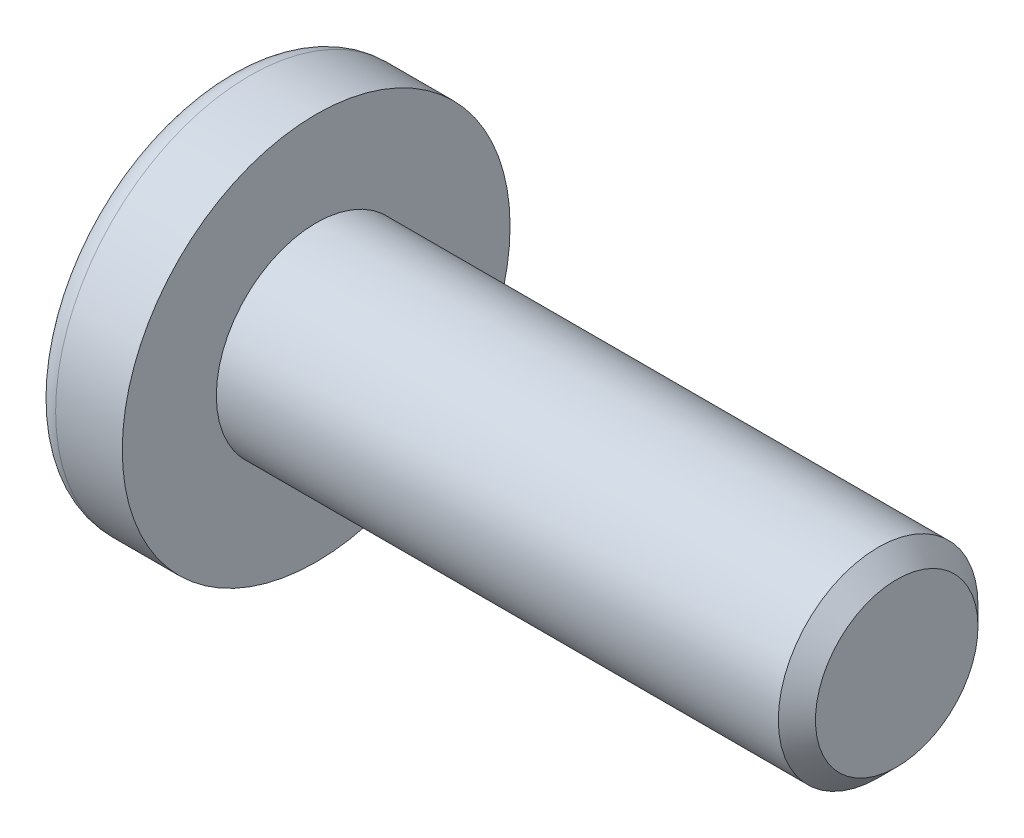
ISO-10303-21;
HEADER;
FILE_DESCRIPTION(('STEP AP214'),'2;1');
FILE_NAME('part.step','',(''),(''),'','','');
FILE_SCHEMA(('AUTOMOTIVE_DESIGN { 1 0 10303 214 1 1 1 1 }'));
ENDSEC;
DATA;
#1=APPLICATION_CONTEXT('core data for automotive mechanical design processes');
#2=APPLICATION_PROTOCOL_DEFINITION('international standard','automotive_design',2000,#1);
#3=PRODUCT_CONTEXT('',#1,'mechanical');
#4=PRODUCT('Part','Part','',(#3));
#5=PRODUCT_RELATED_PRODUCT_CATEGORY('part','',(#4));
#6=PRODUCT_DEFINITION_FORMATION('','',#4);
#7=PRODUCT_DEFINITION_CONTEXT('part definition',#1,'design');
#8=PRODUCT_DEFINITION('design','',#6,#7);
#9=PRODUCT_DEFINITION_SHAPE('','',#8);
#10=(LENGTH_UNIT() NAMED_UNIT(*) SI_UNIT(.MILLI.,.METRE.));
#11=(NAMED_UNIT(*) PLANE_ANGLE_UNIT() SI_UNIT($,.RADIAN.));
#12=(NAMED_UNIT(*) SI_UNIT($,.STERADIAN.) SOLID_ANGLE_UNIT());
#13=UNCERTAINTY_MEASURE_WITH_UNIT(LENGTH_MEASURE(1.E-05),#10,'distance_accuracy_value','');
#14=(GEOMETRIC_REPRESENTATION_CONTEXT(3) GLOBAL_UNCERTAINTY_ASSIGNED_CONTEXT((#13)) GLOBAL_UNIT_ASSIGNED_CONTEXT((#10,
#11,#12)) REPRESENTATION_CONTEXT('',''));
#15=CARTESIAN_POINT('',(0.,0.,0.));
#16=DIRECTION('',(0.,0.,1.));
#17=DIRECTION('',(1.,0.,0.));
#18=AXIS2_PLACEMENT_3D('',#15,#16,#17);
#19=CARTESIAN_POINT('',(3.49504,0.,0.));
#20=DIRECTION('',(-1.,0.,0.));
#21=DIRECTION('',(0.,1.,0.));
#22=AXIS2_PLACEMENT_3D('',#19,#20,#21);
#23=SPHERICAL_SURFACE('',#22,3.49504);
#24=CARTESIAN_POINT('',(0.638066947960321,0.,0.));
#25=DIRECTION('',(-1.,0.,0.));
#26=DIRECTION('',(0.,0.,1.));
#27=AXIS2_PLACEMENT_3D('',#24,#25,#26);
#28=CIRCLE('',#27,2.01320877742947);
#29=CARTESIAN_POINT('',(0.638066947960321,0.,2.01320877742947));
#30=VERTEX_POINT('',#29);
#31=EDGE_CURVE('E156',#30,#30,#28,.T.);
#32=ORIENTED_EDGE('',*,*,#31,.T.);
#33=EDGE_LOOP('',(#32));
#34=FACE_BOUND('',#33,.T.);
#35=CARTESIAN_POINT('',(3.48860800425343,-0.0562204072662827,0.));
#36=DIRECTION('',(-0.113665320353011,-0.99351909641891,0.));
#37=DIRECTION('',(0.99351909641891,-0.113665320353011,0.));
#38=AXIS2_PLACEMENT_3D('',#35,#36,#37);
#39=CIRCLE('',#38,3.49458187725478);
#40=CARTESIAN_POINT('',(0.227775025036725,0.316840992898337,1.19995665346604));
#41=VERTEX_POINT('',#40);
#42=CARTESIAN_POINT('',(0.033060362162214,0.339117670430593,0.339117670430594));
#43=VERTEX_POINT('',#42);
#44=EDGE_CURVE('E266',#41,#43,#39,.T.);
#45=ORIENTED_EDGE('',*,*,#44,.F.);
#46=CARTESIAN_POINT('',(2.78874832810788,0.,-0.872695468934766));
#47=DIRECTION('',(0.629103472698606,0.,0.777321568360582));
#48=DIRECTION('',(0.777321568360582,0.,-0.629103472698606));
#49=AXIS2_PLACEMENT_3D('',#46,#47,#48);
#50=CIRCLE('',#49,3.30981257691679);
#51=CARTESIAN_POINT('',(0.227775025036724,-0.316840992898345,1.19995665346604));
#52=VERTEX_POINT('',#51);
#53=EDGE_CURVE('E155',#41,#52,#50,.T.);
#54=ORIENTED_EDGE('',*,*,#53,.T.);
#55=CARTESIAN_POINT('',(3.48860800425343,0.0562204072662819,0.));
#56=DIRECTION('',(-0.113665320353011,0.99351909641891,0.));
#57=DIRECTION('',(-0.99351909641891,-0.113665320353011,0.));
#58=AXIS2_PLACEMENT_3D('',#55,#56,#57);
#59=CIRCLE('',#58,3.49458187725478);
#60=CARTESIAN_POINT('',(0.0330603621622127,-0.339117670430595,0.339117670430594));
#61=VERTEX_POINT('',#60);
#62=EDGE_CURVE('E111',#61,#52,#59,.T.);
#63=ORIENTED_EDGE('',*,*,#62,.F.);
#64=CARTESIAN_POINT('',(3.48860800425343,0.,-0.056220407266282));
#65=DIRECTION('',(-0.113665320353011,0.,-0.99351909641891));
#66=DIRECTION('',(-0.99351909641891,0.,0.113665320353011));
#67=AXIS2_PLACEMENT_3D('',#64,#65,#66);
#68=CIRCLE('',#67,3.49458187725478);
#69=CARTESIAN_POINT('',(0.227775025036724,-1.19995665346604,0.316840992898341));
#70=VERTEX_POINT('',#69);
#71=EDGE_CURVE('E136',#70,#61,#68,.T.);
#72=ORIENTED_EDGE('',*,*,#71,.F.);
#73=CARTESIAN_POINT('',(2.78874832810788,0.872695468934764,0.));
#74=DIRECTION('',(0.629103472698606,-0.777321568360582,0.));
#75=DIRECTION('',(0.777321568360582,0.629103472698606,0.));
#76=AXIS2_PLACEMENT_3D('',#73,#74,#75);
#77=CIRCLE('',#76,3.30981257691679);
#78=CARTESIAN_POINT('',(0.227775025036722,-1.19995665346604,-0.316840992898341));
#79=VERTEX_POINT('',#78);
#80=EDGE_CURVE('E144',#70,#79,#77,.T.);
#81=ORIENTED_EDGE('',*,*,#80,.T.);
#82=CARTESIAN_POINT('',(3.48860800425343,0.,0.0562204072662826));
#83=DIRECTION('',(-0.113665320353011,0.,0.99351909641891));
#84=DIRECTION('',(0.99351909641891,0.,0.113665320353011));
#85=AXIS2_PLACEMENT_3D('',#82,#83,#84);
#86=CIRCLE('',#85,3.49458187725478);
#87=CARTESIAN_POINT('',(0.0330603621622127,-0.339117670430592,-0.339117670430594));
#88=VERTEX_POINT('',#87);
#89=EDGE_CURVE('E52',#88,#79,#86,.T.);
#90=ORIENTED_EDGE('',*,*,#89,.F.);
#91=CARTESIAN_POINT('',(0.227775025036724,-0.316840992898336,-1.19995665346604));
#92=VERTEX_POINT('',#91);
#93=EDGE_CURVE('E261',#92,#88,#59,.T.);
#94=ORIENTED_EDGE('',*,*,#93,.F.);
#95=CARTESIAN_POINT('',(2.78874832810788,0.,0.872695468934766));
#96=DIRECTION('',(0.629103472698606,0.,-0.777321568360582));
#97=DIRECTION('',(-0.777321568360582,0.,-0.629103472698606));
#98=AXIS2_PLACEMENT_3D('',#95,#96,#97);
#99=CIRCLE('',#98,3.30981257691679);
#100=CARTESIAN_POINT('',(0.227775025036724,0.316840992898345,-1.19995665346604));
#101=VERTEX_POINT('',#100);
#102=EDGE_CURVE('E137',#92,#101,#99,.T.);
#103=ORIENTED_EDGE('',*,*,#102,.T.);
#104=CARTESIAN_POINT('',(0.033060362162214,0.339117670430595,-0.339117670430594));
#105=VERTEX_POINT('',#104);
#106=EDGE_CURVE('E271',#105,#101,#39,.T.);
#107=ORIENTED_EDGE('',*,*,#106,.F.);
#108=CARTESIAN_POINT('',(0.227775025036726,1.19995665346604,-0.316840992898341));
#109=VERTEX_POINT('',#108);
#110=EDGE_CURVE('E172',#109,#105,#86,.T.);
#111=ORIENTED_EDGE('',*,*,#110,.F.);
#112=CARTESIAN_POINT('',(2.78874832810788,-0.872695468934769,0.));
#113=DIRECTION('',(0.629103472698606,0.777321568360582,0.));
#114=DIRECTION('',(-0.777321568360582,0.629103472698606,0.));
#115=AXIS2_PLACEMENT_3D('',#112,#113,#114);
#116=CIRCLE('',#115,3.30981257691679);
#117=CARTESIAN_POINT('',(0.227775025036726,1.19995665346604,0.31684099289834));
#118=VERTEX_POINT('',#117);
#119=EDGE_CURVE('E60',#109,#118,#116,.T.);
#120=ORIENTED_EDGE('',*,*,#119,.T.);
#121=EDGE_CURVE('E170',#43,#118,#68,.T.);
#122=ORIENTED_EDGE('',*,*,#121,.F.);
#123=EDGE_LOOP('',(#45,#54,#63,#72,#81,#90,#94,#103,#107,#111,#120,#122));
#124=FACE_BOUND('',#123,.T.);
#125=ADVANCED_FACE('F37',(#34,#124),#23,.T.);
#126=CARTESIAN_POINT('',(1.71044397905759,0.,-0.147213612565445));
#127=DIRECTION('',(-0.113665320353011,0.,0.99351909641891));
#128=DIRECTION('',(0.99351909641891,0.,0.113665320353011));
#129=AXIS2_PLACEMENT_3D('',#126,#127,#128);
#130=PLANE('',#129);
#131=ORIENTED_EDGE('',*,*,#110,.T.);
#132=DIRECTION('',(0.987162587649563,-0.112938092654823,0.112938092654823));
#133=VECTOR('',#132,1.);
#134=CARTESIAN_POINT('',(1.72685656853982,0.145335901056886,-0.145335901056885));
#135=LINE('',#134,#133);
#136=CARTESIAN_POINT('',(1.4986,0.171450000000001,-0.171449999999999));
#137=VERTEX_POINT('',#136);
#138=EDGE_CURVE('E269',#105,#137,#135,.T.);
#139=ORIENTED_EDGE('',*,*,#138,.T.);
#140=DIRECTION('',(0.774265880811046,-0.626630437436058,0.0885812660249925));
#141=VECTOR('',#140,1.);
#142=CARTESIAN_POINT('',(0.,1.3843,-0.3429));
#143=LINE('',#142,#141);
#144=EDGE_CURVE('E160',#109,#137,#143,.T.);
#145=ORIENTED_EDGE('',*,*,#144,.F.);
#146=EDGE_LOOP('',(#131,#139,#145));
#147=FACE_BOUND('',#146,.T.);
#148=ADVANCED_FACE('F191',(#147),#130,.T.);
#149=DIRECTION('',(0.774265880811046,0.626630437436058,0.0885812660249925));
#150=VECTOR('',#149,1.);
#151=CARTESIAN_POINT('',(0.,-1.3843,-0.3429));
#152=LINE('',#151,#150);
#153=CARTESIAN_POINT('',(1.4986,-0.17145,-0.17145));
#154=VERTEX_POINT('',#153);
#155=EDGE_CURVE('E145',#79,#154,#152,.T.);
#156=ORIENTED_EDGE('',*,*,#155,.T.);
#157=DIRECTION('',(-0.987162587649563,-0.112938092654822,-0.112938092654823));
#158=VECTOR('',#157,1.);
#159=CARTESIAN_POINT('',(1.72685656853982,-0.145335901056885,-0.145335901056885));
#160=LINE('',#159,#158);
#161=EDGE_CURVE('E257',#154,#88,#160,.T.);
#162=ORIENTED_EDGE('',*,*,#161,.T.);
#163=ORIENTED_EDGE('',*,*,#89,.T.);
#164=EDGE_LOOP('',(#156,#162,#163));
#165=FACE_BOUND('',#164,.T.);
#166=ADVANCED_FACE('F197',(#165),#130,.T.);
#167=CARTESIAN_POINT('',(1.71044397905759,0.,0.147213612565445));
#168=DIRECTION('',(-0.113665320353011,0.,-0.99351909641891));
#169=DIRECTION('',(-0.99351909641891,0.,0.113665320353011));
#170=AXIS2_PLACEMENT_3D('',#167,#168,#169);
#171=PLANE('',#170);
#172=DIRECTION('',(0.774265880811046,-0.626630437436058,-0.0885812660249922));
#173=VECTOR('',#172,1.);
#174=CARTESIAN_POINT('',(0.,1.3843,0.342899999999999));
#175=LINE('',#174,#173);
#176=CARTESIAN_POINT('',(1.4986,0.17145,0.17145));
#177=VERTEX_POINT('',#176);
#178=EDGE_CURVE('E250',#118,#177,#175,.T.);
#179=ORIENTED_EDGE('',*,*,#178,.T.);
#180=DIRECTION('',(-0.987162587649563,0.112938092654822,0.112938092654823));
#181=VECTOR('',#180,1.);
#182=CARTESIAN_POINT('',(1.72685656853981,0.145335901056885,0.145335901056886));
#183=LINE('',#182,#181);
#184=EDGE_CURVE('E263',#177,#43,#183,.T.);
#185=ORIENTED_EDGE('',*,*,#184,.T.);
#186=ORIENTED_EDGE('',*,*,#121,.T.);
#187=EDGE_LOOP('',(#179,#185,#186));
#188=FACE_BOUND('',#187,.T.);
#189=ADVANCED_FACE('F220',(#188),#171,.T.);
#190=ORIENTED_EDGE('',*,*,#71,.T.);
#191=DIRECTION('',(0.987162587649563,0.112938092654823,-0.112938092654823));
#192=VECTOR('',#191,1.);
#193=CARTESIAN_POINT('',(1.72685656853982,-0.145335901056886,0.145335901056886));
#194=LINE('',#193,#192);
#195=CARTESIAN_POINT('',(1.4986,-0.171450000000001,0.171449999999999));
#196=VERTEX_POINT('',#195);
#197=EDGE_CURVE('E109',#61,#196,#194,.T.);
#198=ORIENTED_EDGE('',*,*,#197,.T.);
#199=DIRECTION('',(0.774265880811046,0.626630437436058,-0.0885812660249922));
#200=VECTOR('',#199,1.);
#201=CARTESIAN_POINT('',(0.,-1.3843,0.342899999999999));
#202=LINE('',#201,#200);
#203=EDGE_CURVE('E134',#70,#196,#202,.T.);
#204=ORIENTED_EDGE('',*,*,#203,.F.);
#205=EDGE_LOOP('',(#190,#198,#204));
#206=FACE_BOUND('',#205,.T.);
#207=ADVANCED_FACE('F133',(#206),#171,.T.);
#208=CARTESIAN_POINT('',(-25.4,0.,0.));
#209=DIRECTION('',(-1.,0.,0.));
#210=DIRECTION('',(0.,0.,1.));
#211=AXIS2_PLACEMENT_3D('',#208,#209,#210);
#212=CYLINDRICAL_SURFACE('',#211,1.0922);
#213=CARTESIAN_POINT('',(7.7216,0.,0.));
#214=DIRECTION('',(1.,0.,0.));
#215=DIRECTION('',(0.,0.,-1.));
#216=AXIS2_PLACEMENT_3D('',#213,#214,#215);
#217=CIRCLE('',#216,1.0922);
#218=CARTESIAN_POINT('',(7.7216,0.,-1.0922));
#219=VERTEX_POINT('',#218);
#220=EDGE_CURVE('E45',#219,#219,#217,.F.);
#221=ORIENTED_EDGE('',*,*,#220,.T.);
#222=EDGE_LOOP('',(#221));
#223=FACE_BOUND('',#222,.T.);
#224=CARTESIAN_POINT('',(1.5748,0.,0.));
#225=DIRECTION('',(-1.,0.,0.));
#226=DIRECTION('',(0.,0.,1.));
#227=AXIS2_PLACEMENT_3D('',#224,#225,#226);
#228=CIRCLE('',#227,1.0922);
#229=CARTESIAN_POINT('',(1.5748,0.,1.0922));
#230=VERTEX_POINT('',#229);
#231=EDGE_CURVE('E166',#230,#230,#228,.T.);
#232=ORIENTED_EDGE('',*,*,#231,.F.);
#233=EDGE_LOOP('',(#232));
#234=FACE_BOUND('',#233,.T.);
#235=ADVANCED_FACE('F178',(#223,#234),#212,.T.);
#236=CARTESIAN_POINT('',(1.5748,1.0922,0.));
#237=DIRECTION('',(-1.,0.,0.));
#238=DIRECTION('',(0.,0.,1.));
#239=AXIS2_PLACEMENT_3D('',#236,#237,#238);
#240=PLANE('',#239);
#241=CARTESIAN_POINT('',(1.5748,0.,0.));
#242=DIRECTION('',(-1.,0.,0.));
#243=DIRECTION('',(0.,0.,1.));
#244=AXIS2_PLACEMENT_3D('',#241,#242,#243);
#245=CIRCLE('',#244,2.1209);
#246=CARTESIAN_POINT('',(1.5748,0.,2.1209));
#247=VERTEX_POINT('',#246);
#248=EDGE_CURVE('E163',#247,#247,#245,.T.);
#249=ORIENTED_EDGE('',*,*,#248,.F.);
#250=EDGE_LOOP('',(#249));
#251=FACE_BOUND('',#250,.T.);
#252=ORIENTED_EDGE('',*,*,#231,.T.);
#253=EDGE_LOOP('',(#252));
#254=FACE_BOUND('',#253,.T.);
#255=ADVANCED_FACE('F212',(#251,#254),#240,.F.);
#256=CARTESIAN_POINT('',(-25.4,0.,0.));
#257=DIRECTION('',(-1.,0.,0.));
#258=DIRECTION('',(0.,0.,1.));
#259=AXIS2_PLACEMENT_3D('',#256,#257,#258);
#260=CYLINDRICAL_SURFACE('',#259,2.1209);
#261=ORIENTED_EDGE('',*,*,#248,.T.);
#262=EDGE_LOOP('',(#261));
#263=FACE_BOUND('',#262,.T.);
#264=CARTESIAN_POINT('',(0.845695803486458,0.,0.));
#265=DIRECTION('',(-1.,0.,0.));
#266=DIRECTION('',(0.,0.,1.));
#267=AXIS2_PLACEMENT_3D('',#264,#265,#266);
#268=CIRCLE('',#267,2.1209);
#269=CARTESIAN_POINT('',(0.845695803486458,0.,2.1209));
#270=VERTEX_POINT('',#269);
#271=EDGE_CURVE('E159',#270,#270,#268,.T.);
#272=ORIENTED_EDGE('',*,*,#271,.F.);
#273=EDGE_LOOP('',(#272));
#274=FACE_BOUND('',#273,.T.);
#275=ADVANCED_FACE('F208',(#263,#274),#260,.T.);
#276=CARTESIAN_POINT('',(0.845695803486459,0.,0.));
#277=DIRECTION('',(-1.,0.,0.));
#278=DIRECTION('',(0.,0.,1.));
#279=AXIS2_PLACEMENT_3D('',#276,#277,#278);
#280=TOROIDAL_SURFACE('',#279,1.8669,0.254000000000001);
#281=ORIENTED_EDGE('',*,*,#271,.T.);
#282=EDGE_LOOP('',(#281));
#283=FACE_BOUND('',#282,.T.);
#284=ORIENTED_EDGE('',*,*,#31,.F.);
#285=EDGE_LOOP('',(#284));
#286=FACE_BOUND('',#285,.T.);
#287=ADVANCED_FACE('F205',(#283,#286),#280,.T.);
#288=CARTESIAN_POINT('',(7.9248,1.0922,0.));
#289=DIRECTION('',(1.,0.,0.));
#290=DIRECTION('',(0.,0.,-1.));
#291=AXIS2_PLACEMENT_3D('',#288,#289,#290);
#292=PLANE('',#291);
#293=CARTESIAN_POINT('',(7.9248,0.,0.));
#294=DIRECTION('',(1.,0.,0.));
#295=DIRECTION('',(0.,0.,-1.));
#296=AXIS2_PLACEMENT_3D('',#293,#294,#295);
#297=CIRCLE('',#296,0.888999999999997);
#298=CARTESIAN_POINT('',(7.9248,0.,-0.888999999999997));
#299=VERTEX_POINT('',#298);
#300=EDGE_CURVE('E11',#299,#299,#297,.T.);
#301=ORIENTED_EDGE('',*,*,#300,.T.);
#302=EDGE_LOOP('',(#301));
#303=FACE_BOUND('',#302,.T.);
#304=ADVANCED_FACE('F203',(#303),#292,.T.);
#305=CARTESIAN_POINT('',(1.4986,0.17145,0.17145));
#306=DIRECTION('',(0.629103472698606,0.777321568360582,0.));
#307=DIRECTION('',(-0.777321568360582,0.629103472698606,0.));
#308=AXIS2_PLACEMENT_3D('',#305,#306,#307);
#309=PLANE('',#308);
#310=ORIENTED_EDGE('',*,*,#144,.T.);
#311=DIRECTION('',(0.,0.,-1.));
#312=VECTOR('',#311,1.);
#313=CARTESIAN_POINT('',(1.4986,0.17145,0.17145));
#314=LINE('',#313,#312);
#315=EDGE_CURVE('E127',#177,#137,#314,.T.);
#316=ORIENTED_EDGE('',*,*,#315,.F.);
#317=ORIENTED_EDGE('',*,*,#178,.F.);
#318=ORIENTED_EDGE('',*,*,#119,.F.);
#319=EDGE_LOOP('',(#310,#316,#317,#318));
#320=FACE_BOUND('',#319,.T.);
#321=ADVANCED_FACE('F229',(#320),#309,.F.);
#322=CARTESIAN_POINT('',(0.,-1.3843,-0.3429));
#323=DIRECTION('',(0.629103472698606,-0.777321568360582,0.));
#324=DIRECTION('',(0.777321568360582,0.629103472698606,0.));
#325=AXIS2_PLACEMENT_3D('',#322,#323,#324);
#326=PLANE('',#325);
#327=ORIENTED_EDGE('',*,*,#203,.T.);
#328=DIRECTION('',(0.,0.,1.));
#329=VECTOR('',#328,1.);
#330=CARTESIAN_POINT('',(1.4986,-0.17145,-0.17145));
#331=LINE('',#330,#329);
#332=EDGE_CURVE('E126',#154,#196,#331,.T.);
#333=ORIENTED_EDGE('',*,*,#332,.F.);
#334=ORIENTED_EDGE('',*,*,#155,.F.);
#335=ORIENTED_EDGE('',*,*,#80,.F.);
#336=EDGE_LOOP('',(#327,#333,#334,#335));
#337=FACE_BOUND('',#336,.T.);
#338=ADVANCED_FACE('F141',(#337),#326,.F.);
#339=CARTESIAN_POINT('',(1.4986,0.17145,-0.17145));
#340=DIRECTION('',(-1.,0.,0.));
#341=DIRECTION('',(0.,0.,1.));
#342=AXIS2_PLACEMENT_3D('',#339,#340,#341);
#343=PLANE('',#342);
#344=DIRECTION('',(0.,1.,0.));
#345=VECTOR('',#344,1.);
#346=CARTESIAN_POINT('',(1.4986,-0.17145,-0.17145));
#347=LINE('',#346,#345);
#348=EDGE_CURVE('E149',#154,#137,#347,.T.);
#349=ORIENTED_EDGE('',*,*,#348,.F.);
#350=ORIENTED_EDGE('',*,*,#332,.T.);
#351=DIRECTION('',(0.,-1.,0.));
#352=VECTOR('',#351,1.);
#353=CARTESIAN_POINT('',(1.4986,0.17145,0.17145));
#354=LINE('',#353,#352);
#355=EDGE_CURVE('E118',#177,#196,#354,.T.);
#356=ORIENTED_EDGE('',*,*,#355,.F.);
#357=ORIENTED_EDGE('',*,*,#315,.T.);
#358=EDGE_LOOP('',(#349,#350,#356,#357));
#359=FACE_BOUND('',#358,.T.);
#360=ADVANCED_FACE('F147',(#359),#343,.T.);
#361=CARTESIAN_POINT('',(0.,0.342900000000005,-1.3843));
#362=DIRECTION('',(0.629103472698606,0.,-0.777321568360582));
#363=DIRECTION('',(0.777321568360582,0.,0.629103472698606));
#364=AXIS2_PLACEMENT_3D('',#361,#362,#363);
#365=PLANE('',#364);
#366=DIRECTION('',(0.774265880811046,0.08858126602499,0.626630437436058));
#367=VECTOR('',#366,1.);
#368=CARTESIAN_POINT('',(0.,-0.342899999999994,-1.3843));
#369=LINE('',#368,#367);
#370=EDGE_CURVE('E276',#92,#154,#369,.T.);
#371=ORIENTED_EDGE('',*,*,#370,.T.);
#372=ORIENTED_EDGE('',*,*,#348,.T.);
#373=DIRECTION('',(0.774265880811046,-0.0885812660249947,0.626630437436057));
#374=VECTOR('',#373,1.);
#375=CARTESIAN_POINT('',(0.,0.342900000000005,-1.3843));
#376=LINE('',#375,#374);
#377=EDGE_CURVE('E115',#101,#137,#376,.T.);
#378=ORIENTED_EDGE('',*,*,#377,.F.);
#379=ORIENTED_EDGE('',*,*,#102,.F.);
#380=EDGE_LOOP('',(#371,#372,#378,#379));
#381=FACE_BOUND('',#380,.T.);
#382=ADVANCED_FACE('F231',(#381),#365,.F.);
#383=CARTESIAN_POINT('',(1.71044397905759,-0.147213612565445,0.));
#384=DIRECTION('',(-0.113665320353011,0.99351909641891,0.));
#385=DIRECTION('',(-0.99351909641891,-0.113665320353011,0.));
#386=AXIS2_PLACEMENT_3D('',#383,#384,#385);
#387=PLANE('',#386);
#388=ORIENTED_EDGE('',*,*,#93,.T.);
#389=ORIENTED_EDGE('',*,*,#161,.F.);
#390=ORIENTED_EDGE('',*,*,#370,.F.);
#391=EDGE_LOOP('',(#388,#389,#390));
#392=FACE_BOUND('',#391,.T.);
#393=ADVANCED_FACE('F188',(#392),#387,.T.);
#394=CARTESIAN_POINT('',(1.71044397905759,0.147213612565445,0.));
#395=DIRECTION('',(-0.113665320353011,-0.99351909641891,0.));
#396=DIRECTION('',(0.99351909641891,-0.113665320353011,0.));
#397=AXIS2_PLACEMENT_3D('',#394,#395,#396);
#398=PLANE('',#397);
#399=ORIENTED_EDGE('',*,*,#106,.T.);
#400=ORIENTED_EDGE('',*,*,#377,.T.);
#401=ORIENTED_EDGE('',*,*,#138,.F.);
#402=EDGE_LOOP('',(#399,#400,#401));
#403=FACE_BOUND('',#402,.T.);
#404=ADVANCED_FACE('F240',(#403),#398,.T.);
#405=CARTESIAN_POINT('',(1.4986,-0.171450000000001,0.171449999999999));
#406=DIRECTION('',(0.629103472698606,0.,0.777321568360582));
#407=DIRECTION('',(-0.777321568360582,0.,0.629103472698606));
#408=AXIS2_PLACEMENT_3D('',#405,#406,#407);
#409=PLANE('',#408);
#410=DIRECTION('',(0.774265880811046,-0.0885812660249903,-0.626630437436058));
#411=VECTOR('',#410,1.);
#412=CARTESIAN_POINT('',(0.,0.342899999999995,1.3843));
#413=LINE('',#412,#411);
#414=EDGE_CURVE('E114',#41,#177,#413,.T.);
#415=ORIENTED_EDGE('',*,*,#414,.T.);
#416=ORIENTED_EDGE('',*,*,#355,.T.);
#417=DIRECTION('',(0.774265880811046,0.0885812660249944,-0.626630437436058));
#418=VECTOR('',#417,1.);
#419=CARTESIAN_POINT('',(0.,-0.342900000000004,1.3843));
#420=LINE('',#419,#418);
#421=EDGE_CURVE('E105',#52,#196,#420,.T.);
#422=ORIENTED_EDGE('',*,*,#421,.F.);
#423=ORIENTED_EDGE('',*,*,#53,.F.);
#424=EDGE_LOOP('',(#415,#416,#422,#423));
#425=FACE_BOUND('',#424,.T.);
#426=ADVANCED_FACE('F119',(#425),#409,.F.);
#427=ORIENTED_EDGE('',*,*,#44,.T.);
#428=ORIENTED_EDGE('',*,*,#184,.F.);
#429=ORIENTED_EDGE('',*,*,#414,.F.);
#430=EDGE_LOOP('',(#427,#428,#429));
#431=FACE_BOUND('',#430,.T.);
#432=ADVANCED_FACE('F186',(#431),#398,.T.);
#433=ORIENTED_EDGE('',*,*,#62,.T.);
#434=ORIENTED_EDGE('',*,*,#421,.T.);
#435=ORIENTED_EDGE('',*,*,#197,.F.);
#436=EDGE_LOOP('',(#433,#434,#435));
#437=FACE_BOUND('',#436,.T.);
#438=ADVANCED_FACE('F107',(#437),#387,.T.);
#439=CARTESIAN_POINT('',(7.7216,0.,0.));
#440=DIRECTION('',(-1.,0.,0.));
#441=DIRECTION('',(0.,0.,1.));
#442=AXIS2_PLACEMENT_3D('',#439,#440,#441);
#443=CONICAL_SURFACE('',#442,1.0922,0.785398163397455);
#444=ORIENTED_EDGE('',*,*,#300,.F.);
#445=EDGE_LOOP('',(#444));
#446=FACE_BOUND('',#445,.T.);
#447=ORIENTED_EDGE('',*,*,#220,.F.);
#448=EDGE_LOOP('',(#447));
#449=FACE_BOUND('',#448,.T.);
#450=ADVANCED_FACE('F39',(#446,#449),#443,.T.);
#451=CLOSED_SHELL('',(#125,#148,#166,#189,#207,#235,#255,#275,#287,#304,#321,#338,#360,#382,
#393,#404,#426,#432,#438,#450));
#452=MANIFOLD_SOLID_BREP('B2',#451);
#453=ADVANCED_BREP_SHAPE_REPRESENTATION('',(#18,#452),#14);
#454=SHAPE_DEFINITION_REPRESENTATION(#9,#453);
ENDSEC;
END-ISO-10303-21;
